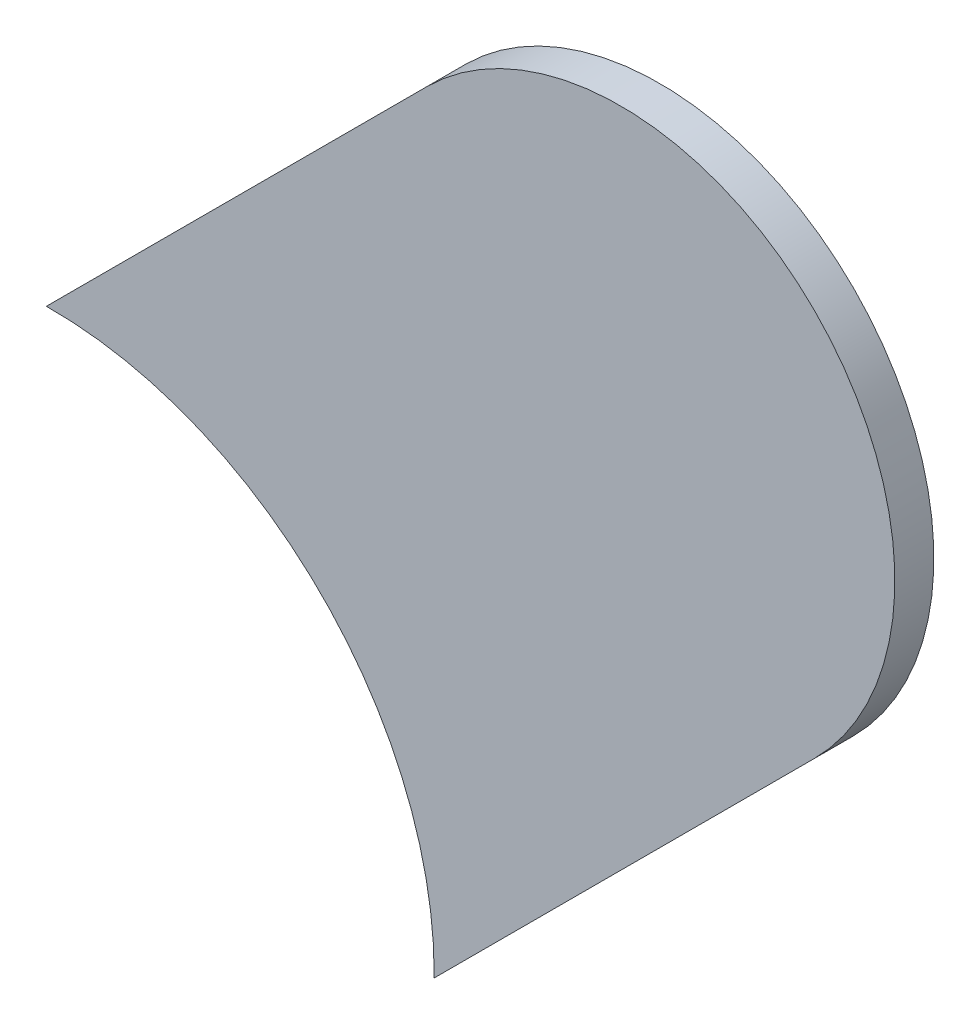
ISO-10303-21;
HEADER;
FILE_DESCRIPTION(('STEP AP214'),'2;1');
FILE_NAME('part.step','',(''),(''),'','','');
FILE_SCHEMA(('AUTOMOTIVE_DESIGN { 1 0 10303 214 1 1 1 1 }'));
ENDSEC;
DATA;
#1=APPLICATION_CONTEXT('core data for automotive mechanical design processes');
#2=APPLICATION_PROTOCOL_DEFINITION('international standard','automotive_design',2000,#1);
#3=PRODUCT_CONTEXT('',#1,'mechanical');
#4=PRODUCT('Part','Part','',(#3));
#5=PRODUCT_RELATED_PRODUCT_CATEGORY('part','',(#4));
#6=PRODUCT_DEFINITION_FORMATION('','',#4);
#7=PRODUCT_DEFINITION_CONTEXT('part definition',#1,'design');
#8=PRODUCT_DEFINITION('design','',#6,#7);
#9=PRODUCT_DEFINITION_SHAPE('','',#8);
#10=(LENGTH_UNIT() NAMED_UNIT(*) SI_UNIT(.MILLI.,.METRE.));
#11=(NAMED_UNIT(*) PLANE_ANGLE_UNIT() SI_UNIT($,.RADIAN.));
#12=(NAMED_UNIT(*) SI_UNIT($,.STERADIAN.) SOLID_ANGLE_UNIT());
#13=UNCERTAINTY_MEASURE_WITH_UNIT(LENGTH_MEASURE(1.E-05),#10,'distance_accuracy_value','');
#14=(GEOMETRIC_REPRESENTATION_CONTEXT(3) GLOBAL_UNCERTAINTY_ASSIGNED_CONTEXT((#13)) GLOBAL_UNIT_ASSIGNED_CONTEXT((#10,
#11,#12)) REPRESENTATION_CONTEXT('',''));
#15=CARTESIAN_POINT('',(0.,0.,0.));
#16=DIRECTION('',(0.,0.,1.));
#17=DIRECTION('',(1.,0.,0.));
#18=AXIS2_PLACEMENT_3D('',#15,#16,#17);
#19=CARTESIAN_POINT('',(105.949973075301,97.8364663153011,0.));
#20=DIRECTION('',(-0.707106781186538,0.707106781186557,0.));
#21=DIRECTION('',(0.707106781186557,0.707106781186538,0.));
#22=AXIS2_PLACEMENT_3D('',#19,#20,#21);
#23=PLANE('',#22);
#24=DIRECTION('',(0.707106781186557,0.707106781186538,0.));
#25=VECTOR('',#24,1.);
#26=CARTESIAN_POINT('',(105.77676838,97.66326162,0.03556));
#27=LINE('',#26,#25);
#28=CARTESIAN_POINT('',(105.949973075301,97.8364663153011,0.03556));
#29=VERTEX_POINT('',#28);
#30=CARTESIAN_POINT('',(106.29675718,98.18325042,0.03556));
#31=VERTEX_POINT('',#30);
#32=EDGE_CURVE('E11',#29,#31,#27,.T.);
#33=ORIENTED_EDGE('',*,*,#32,.F.);
#34=DIRECTION('',(0.,0.,1.));
#35=VECTOR('',#34,1.);
#36=CARTESIAN_POINT('',(105.949973075301,97.8364663153011,0.));
#37=LINE('',#36,#35);
#38=CARTESIAN_POINT('',(105.949973075301,97.8364663153011,0.));
#39=VERTEX_POINT('',#38);
#40=EDGE_CURVE('E24',#39,#29,#37,.T.);
#41=ORIENTED_EDGE('',*,*,#40,.F.);
#42=DIRECTION('',(0.707106781186557,0.707106781186538,0.));
#43=VECTOR('',#42,1.);
#44=CARTESIAN_POINT('',(105.77676838,97.66326162,0.));
#45=LINE('',#44,#43);
#46=CARTESIAN_POINT('',(106.29675718,98.18325042,0.));
#47=VERTEX_POINT('',#46);
#48=EDGE_CURVE('E82',#39,#47,#45,.T.);
#49=ORIENTED_EDGE('',*,*,#48,.T.);
#50=DIRECTION('',(0.,0.,1.));
#51=VECTOR('',#50,1.);
#52=CARTESIAN_POINT('',(106.29675718,98.18325042,0.));
#53=LINE('',#52,#51);
#54=EDGE_CURVE('E37',#47,#31,#53,.T.);
#55=ORIENTED_EDGE('',*,*,#54,.T.);
#56=EDGE_LOOP('',(#33,#41,#49,#55));
#57=FACE_BOUND('',#56,.T.);
#58=ADVANCED_FACE('F17',(#57),#23,.F.);
#59=CARTESIAN_POINT('',(106.1199808,98.3600268,0.));
#60=DIRECTION('',(0.,0.,-1.));
#61=DIRECTION('',(0.707106781186576,-0.707106781186519,0.));
#62=AXIS2_PLACEMENT_3D('',#59,#60,#61);
#63=CYLINDRICAL_SURFACE('',#62,0.249999554103226);
#64=CARTESIAN_POINT('',(106.1199808,98.3600268,0.03556));
#65=DIRECTION('',(0.,0.,1.));
#66=DIRECTION('',(0.707106781186576,-0.707106781186519,0.));
#67=AXIS2_PLACEMENT_3D('',#64,#65,#66);
#68=CIRCLE('',#67,0.249999554103226);
#69=CARTESIAN_POINT('',(105.94320442,98.53680318,0.03556));
#70=VERTEX_POINT('',#69);
#71=EDGE_CURVE('E97',#31,#70,#68,.T.);
#72=ORIENTED_EDGE('',*,*,#71,.F.);
#73=ORIENTED_EDGE('',*,*,#54,.F.);
#74=CARTESIAN_POINT('',(106.1199808,98.3600268,0.));
#75=DIRECTION('',(0.,0.,1.));
#76=DIRECTION('',(0.707106781186576,-0.707106781186519,0.));
#77=AXIS2_PLACEMENT_3D('',#74,#75,#76);
#78=CIRCLE('',#77,0.249999554103226);
#79=CARTESIAN_POINT('',(105.94320442,98.53680318,0.));
#80=VERTEX_POINT('',#79);
#81=EDGE_CURVE('E94',#47,#80,#78,.T.);
#82=ORIENTED_EDGE('',*,*,#81,.T.);
#83=DIRECTION('',(0.,0.,1.));
#84=VECTOR('',#83,1.);
#85=CARTESIAN_POINT('',(105.94320442,98.53680318,0.));
#86=LINE('',#85,#84);
#87=EDGE_CURVE('E92',#80,#70,#86,.T.);
#88=ORIENTED_EDGE('',*,*,#87,.T.);
#89=EDGE_LOOP('',(#72,#73,#82,#88));
#90=FACE_BOUND('',#89,.T.);
#91=ADVANCED_FACE('F103',(#90),#63,.T.);
#92=CARTESIAN_POINT('',(105.94320442,98.53680318,0.));
#93=DIRECTION('',(0.707106781186538,-0.707106781186557,0.));
#94=DIRECTION('',(-0.707106781186557,-0.707106781186538,0.));
#95=AXIS2_PLACEMENT_3D('',#92,#93,#94);
#96=PLANE('',#95);
#97=DIRECTION('',(-0.707106781186557,-0.707106781186538,0.));
#98=VECTOR('',#97,1.);
#99=CARTESIAN_POINT('',(105.94320442,98.53680318,0.03556));
#100=LINE('',#99,#98);
#101=CARTESIAN_POINT('',(105.596420315301,98.1900190753011,0.03556));
#102=VERTEX_POINT('',#101);
#103=EDGE_CURVE('E89',#70,#102,#100,.T.);
#104=ORIENTED_EDGE('',*,*,#103,.F.);
#105=ORIENTED_EDGE('',*,*,#87,.F.);
#106=DIRECTION('',(-0.707106781186557,-0.707106781186538,0.));
#107=VECTOR('',#106,1.);
#108=CARTESIAN_POINT('',(105.94320442,98.53680318,0.));
#109=LINE('',#108,#107);
#110=CARTESIAN_POINT('',(105.596420315301,98.1900190753011,0.));
#111=VERTEX_POINT('',#110);
#112=EDGE_CURVE('E87',#80,#111,#109,.T.);
#113=ORIENTED_EDGE('',*,*,#112,.T.);
#114=DIRECTION('',(0.,0.,1.));
#115=VECTOR('',#114,1.);
#116=CARTESIAN_POINT('',(105.596420315301,98.1900190753011,0.));
#117=LINE('',#116,#115);
#118=EDGE_CURVE('E69',#111,#102,#117,.T.);
#119=ORIENTED_EDGE('',*,*,#118,.T.);
#120=EDGE_LOOP('',(#104,#105,#113,#119));
#121=FACE_BOUND('',#120,.T.);
#122=ADVANCED_FACE('F108',(#121),#96,.F.);
#123=CARTESIAN_POINT('',(105.599992,97.840038,0.));
#124=DIRECTION('',(0.,0.,-1.));
#125=DIRECTION('',(1.,0.,0.));
#126=AXIS2_PLACEMENT_3D('',#123,#124,#125);
#127=CYLINDRICAL_SURFACE('',#126,0.3499993);
#128=DIRECTION('',(0.,0.,1.));
#129=VECTOR('',#128,1.);
#130=CARTESIAN_POINT('',(105.9499913,97.840038,0.));
#131=LINE('',#130,#129);
#132=CARTESIAN_POINT('',(105.9499913,97.840038,0.));
#133=VERTEX_POINT('',#132);
#134=CARTESIAN_POINT('',(105.9499913,97.840038,0.03556));
#135=VERTEX_POINT('',#134);
#136=EDGE_CURVE('E59',#133,#135,#131,.T.);
#137=ORIENTED_EDGE('',*,*,#136,.T.);
#138=CARTESIAN_POINT('',(105.599992,97.840038,0.03556));
#139=DIRECTION('',(0.,0.,1.));
#140=DIRECTION('',(1.,0.,0.));
#141=AXIS2_PLACEMENT_3D('',#138,#139,#140);
#142=CIRCLE('',#141,0.3499993);
#143=EDGE_CURVE('E70',#135,#102,#142,.T.);
#144=ORIENTED_EDGE('',*,*,#143,.T.);
#145=ORIENTED_EDGE('',*,*,#118,.F.);
#146=CARTESIAN_POINT('',(105.599992,97.840038,0.));
#147=DIRECTION('',(0.,0.,1.));
#148=DIRECTION('',(1.,0.,0.));
#149=AXIS2_PLACEMENT_3D('',#146,#147,#148);
#150=CIRCLE('',#149,0.3499993);
#151=EDGE_CURVE('E73',#133,#111,#150,.T.);
#152=ORIENTED_EDGE('',*,*,#151,.F.);
#153=EDGE_LOOP('',(#137,#144,#145,#152));
#154=FACE_BOUND('',#153,.T.);
#155=ADVANCED_FACE('F74',(#154),#127,.F.);
#156=CARTESIAN_POINT('',(105.599992,97.840038,0.));
#157=DIRECTION('',(0.,0.,-1.));
#158=DIRECTION('',(1.,0.,0.));
#159=AXIS2_PLACEMENT_3D('',#156,#157,#158);
#160=CYLINDRICAL_SURFACE('',#159,0.3499993);
#161=ORIENTED_EDGE('',*,*,#40,.T.);
#162=CARTESIAN_POINT('',(105.599992,97.840038,0.03556));
#163=DIRECTION('',(0.,0.,1.));
#164=DIRECTION('',(1.,0.,0.));
#165=AXIS2_PLACEMENT_3D('',#162,#163,#164);
#166=CIRCLE('',#165,0.3499993);
#167=EDGE_CURVE('E65',#29,#135,#166,.T.);
#168=ORIENTED_EDGE('',*,*,#167,.T.);
#169=ORIENTED_EDGE('',*,*,#136,.F.);
#170=EDGE_CURVE('E63',#39,#133,#150,.T.);
#171=ORIENTED_EDGE('',*,*,#170,.F.);
#172=EDGE_LOOP('',(#161,#168,#169,#171));
#173=FACE_BOUND('',#172,.T.);
#174=ADVANCED_FACE('F61',(#173),#160,.F.);
#175=CARTESIAN_POINT('',(105.77676838,97.66326162,0.));
#176=DIRECTION('',(0.,0.,-1.));
#177=DIRECTION('',(-1.,0.,0.));
#178=AXIS2_PLACEMENT_3D('',#175,#176,#177);
#179=PLANE('',#178);
#180=ORIENTED_EDGE('',*,*,#48,.F.);
#181=ORIENTED_EDGE('',*,*,#170,.T.);
#182=ORIENTED_EDGE('',*,*,#151,.T.);
#183=ORIENTED_EDGE('',*,*,#112,.F.);
#184=ORIENTED_EDGE('',*,*,#81,.F.);
#185=EDGE_LOOP('',(#180,#181,#182,#183,#184));
#186=FACE_BOUND('',#185,.T.);
#187=ADVANCED_FACE('F80',(#186),#179,.T.);
#188=CARTESIAN_POINT('',(105.77676838,97.66326162,0.03556));
#189=DIRECTION('',(0.,0.,-1.));
#190=DIRECTION('',(-1.,0.,0.));
#191=AXIS2_PLACEMENT_3D('',#188,#189,#190);
#192=PLANE('',#191);
#193=ORIENTED_EDGE('',*,*,#167,.F.);
#194=ORIENTED_EDGE('',*,*,#32,.T.);
#195=ORIENTED_EDGE('',*,*,#71,.T.);
#196=ORIENTED_EDGE('',*,*,#103,.T.);
#197=ORIENTED_EDGE('',*,*,#143,.F.);
#198=EDGE_LOOP('',(#193,#194,#195,#196,#197));
#199=FACE_BOUND('',#198,.T.);
#200=ADVANCED_FACE('F106',(#199),#192,.F.);
#201=CLOSED_SHELL('',(#58,#91,#122,#155,#174,#187,#200));
#202=MANIFOLD_SOLID_BREP('B1',#201);
#203=ADVANCED_BREP_SHAPE_REPRESENTATION('',(#18,#202),#14);
#204=SHAPE_DEFINITION_REPRESENTATION(#9,#203);
ENDSEC;
END-ISO-10303-21;
